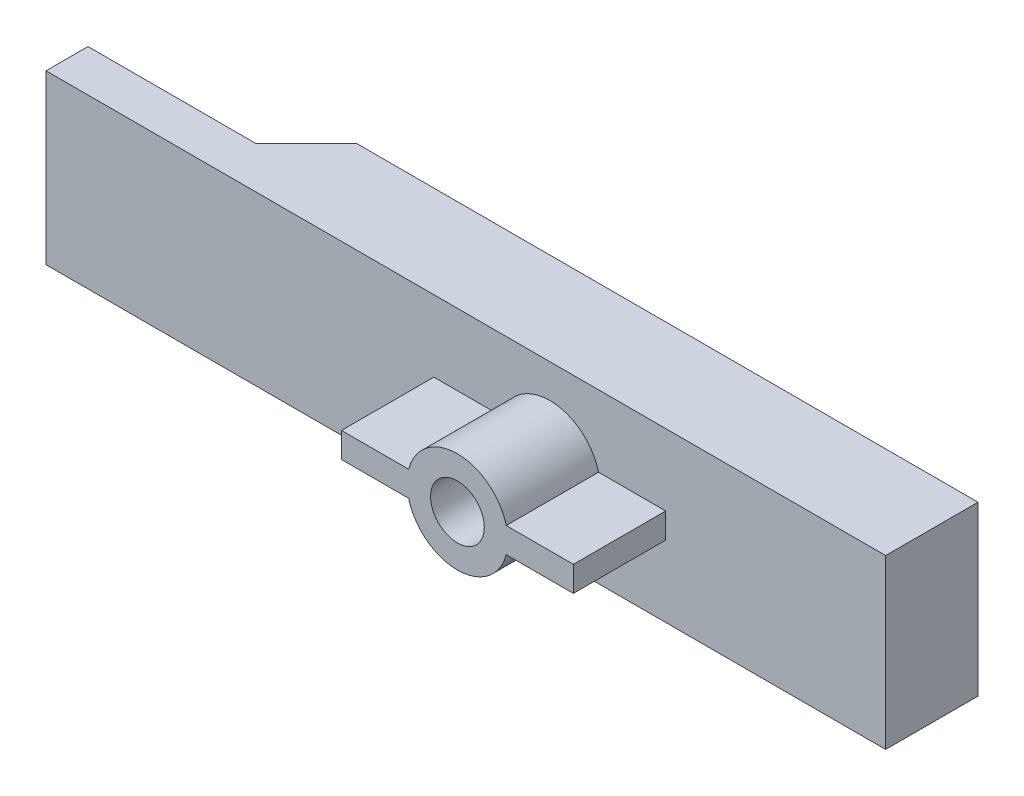
ISO-10303-21;
HEADER;
FILE_DESCRIPTION(('STEP AP214'),'2;1');
FILE_NAME('part.step','',(''),(''),'','','');
FILE_SCHEMA(('AUTOMOTIVE_DESIGN { 1 0 10303 214 1 1 1 1 }'));
ENDSEC;
DATA;
#1=APPLICATION_CONTEXT('core data for automotive mechanical design processes');
#2=APPLICATION_PROTOCOL_DEFINITION('international standard','automotive_design',2000,#1);
#3=PRODUCT_CONTEXT('',#1,'mechanical');
#4=PRODUCT('Part','Part','',(#3));
#5=PRODUCT_RELATED_PRODUCT_CATEGORY('part','',(#4));
#6=PRODUCT_DEFINITION_FORMATION('','',#4);
#7=PRODUCT_DEFINITION_CONTEXT('part definition',#1,'design');
#8=PRODUCT_DEFINITION('design','',#6,#7);
#9=PRODUCT_DEFINITION_SHAPE('','',#8);
#10=(LENGTH_UNIT() NAMED_UNIT(*) SI_UNIT(.MILLI.,.METRE.));
#11=(NAMED_UNIT(*) PLANE_ANGLE_UNIT() SI_UNIT($,.RADIAN.));
#12=(NAMED_UNIT(*) SI_UNIT($,.STERADIAN.) SOLID_ANGLE_UNIT());
#13=UNCERTAINTY_MEASURE_WITH_UNIT(LENGTH_MEASURE(1.E-05),#10,'distance_accuracy_value','');
#14=(GEOMETRIC_REPRESENTATION_CONTEXT(3) GLOBAL_UNCERTAINTY_ASSIGNED_CONTEXT((#13)) GLOBAL_UNIT_ASSIGNED_CONTEXT((#10,
#11,#12)) REPRESENTATION_CONTEXT('',''));
#15=CARTESIAN_POINT('',(0.,0.,0.));
#16=DIRECTION('',(0.,0.,1.));
#17=DIRECTION('',(1.,0.,0.));
#18=AXIS2_PLACEMENT_3D('',#15,#16,#17);
#19=CARTESIAN_POINT('',(0.,0.,2.5));
#20=DIRECTION('',(0.,0.,-1.));
#21=DIRECTION('',(-1.,0.,0.));
#22=AXIS2_PLACEMENT_3D('',#19,#20,#21);
#23=PLANE('',#22);
#24=DIRECTION('',(-1.,0.,0.));
#25=VECTOR('',#24,1.);
#26=CARTESIAN_POINT('',(0.,10.,2.5));
#27=LINE('',#26,#25);
#28=CARTESIAN_POINT('',(40.,10.,2.5));
#29=VERTEX_POINT('',#28);
#30=CARTESIAN_POINT('',(-9.99999999999999,10.,2.5));
#31=VERTEX_POINT('',#30);
#32=EDGE_CURVE('E243',#29,#31,#27,.T.);
#33=ORIENTED_EDGE('',*,*,#32,.T.);
#34=DIRECTION('',(0.,1.,0.));
#35=VECTOR('',#34,1.);
#36=CARTESIAN_POINT('',(-10.,0.,2.5));
#37=LINE('',#36,#35);
#38=CARTESIAN_POINT('',(-10.,0.,2.5));
#39=VERTEX_POINT('',#38);
#40=EDGE_CURVE('E211',#39,#31,#37,.T.);
#41=ORIENTED_EDGE('',*,*,#40,.F.);
#42=DIRECTION('',(1.,0.,0.));
#43=VECTOR('',#42,1.);
#44=CARTESIAN_POINT('',(0.,0.,2.5));
#45=LINE('',#44,#43);
#46=CARTESIAN_POINT('',(40.,0.,2.5));
#47=VERTEX_POINT('',#46);
#48=EDGE_CURVE('E239',#39,#47,#45,.T.);
#49=ORIENTED_EDGE('',*,*,#48,.T.);
#50=DIRECTION('',(0.,1.,0.));
#51=VECTOR('',#50,1.);
#52=CARTESIAN_POINT('',(40.,0.,2.5));
#53=LINE('',#52,#51);
#54=EDGE_CURVE('E241',#47,#29,#53,.T.);
#55=ORIENTED_EDGE('',*,*,#54,.T.);
#56=EDGE_LOOP('',(#33,#41,#49,#55));
#57=FACE_BOUND('',#56,.T.);
#58=DIRECTION('',(-1.,0.,0.));
#59=VECTOR('',#58,1.);
#60=CARTESIAN_POINT('',(22.9047375096556,5.75,2.5));
#61=LINE('',#60,#59);
#62=CARTESIAN_POINT('',(26.9047375096556,5.75,2.5));
#63=VERTEX_POINT('',#62);
#64=CARTESIAN_POINT('',(22.9047375096556,5.75,2.5));
#65=VERTEX_POINT('',#64);
#66=EDGE_CURVE('E153',#63,#65,#61,.T.);
#67=ORIENTED_EDGE('',*,*,#66,.F.);
#68=DIRECTION('',(0.,1.,0.));
#69=VECTOR('',#68,1.);
#70=CARTESIAN_POINT('',(26.9047375096556,5.75,2.5));
#71=LINE('',#70,#69);
#72=CARTESIAN_POINT('',(26.9047375096556,4.25,2.5));
#73=VERTEX_POINT('',#72);
#74=EDGE_CURVE('E149',#73,#63,#71,.T.);
#75=ORIENTED_EDGE('',*,*,#74,.F.);
#76=DIRECTION('',(1.,0.,0.));
#77=VECTOR('',#76,1.);
#78=CARTESIAN_POINT('',(22.9047375096556,4.25,2.5));
#79=LINE('',#78,#77);
#80=CARTESIAN_POINT('',(22.9047375096556,4.25,2.5));
#81=VERTEX_POINT('',#80);
#82=EDGE_CURVE('E175',#81,#73,#79,.T.);
#83=ORIENTED_EDGE('',*,*,#82,.F.);
#84=CARTESIAN_POINT('',(20.,5.,2.5));
#85=DIRECTION('',(0.,0.,-1.));
#86=DIRECTION('',(-1.,0.,0.));
#87=AXIS2_PLACEMENT_3D('',#84,#85,#86);
#88=CIRCLE('',#87,2.99999999999999);
#89=CARTESIAN_POINT('',(17.0952624903444,4.25,2.5));
#90=VERTEX_POINT('',#89);
#91=EDGE_CURVE('E251',#90,#81,#88,.F.);
#92=ORIENTED_EDGE('',*,*,#91,.F.);
#93=DIRECTION('',(1.,0.,0.));
#94=VECTOR('',#93,1.);
#95=CARTESIAN_POINT('',(17.0952624903444,4.25,2.5));
#96=LINE('',#95,#94);
#97=CARTESIAN_POINT('',(13.0952624903444,4.25,2.5));
#98=VERTEX_POINT('',#97);
#99=EDGE_CURVE('E179',#98,#90,#96,.T.);
#100=ORIENTED_EDGE('',*,*,#99,.F.);
#101=DIRECTION('',(0.,-1.,0.));
#102=VECTOR('',#101,1.);
#103=CARTESIAN_POINT('',(13.0952624903444,5.75,2.5));
#104=LINE('',#103,#102);
#105=CARTESIAN_POINT('',(13.0952624903444,5.75,2.5));
#106=VERTEX_POINT('',#105);
#107=EDGE_CURVE('E183',#106,#98,#104,.T.);
#108=ORIENTED_EDGE('',*,*,#107,.F.);
#109=DIRECTION('',(-1.,0.,0.));
#110=VECTOR('',#109,1.);
#111=CARTESIAN_POINT('',(17.0952624903444,5.75,2.5));
#112=LINE('',#111,#110);
#113=CARTESIAN_POINT('',(17.0952624903444,5.75,2.5));
#114=VERTEX_POINT('',#113);
#115=EDGE_CURVE('E187',#114,#106,#112,.T.);
#116=ORIENTED_EDGE('',*,*,#115,.F.);
#117=EDGE_CURVE('E250',#65,#114,#88,.F.);
#118=ORIENTED_EDGE('',*,*,#117,.F.);
#119=EDGE_LOOP('',(#67,#75,#83,#92,#100,#108,#116,#118));
#120=FACE_BOUND('',#119,.T.);
#121=ADVANCED_FACE('F41',(#57,#120),#23,.F.);
#122=CARTESIAN_POINT('',(20.,5.,8.));
#123=DIRECTION('',(0.,0.,-1.));
#124=DIRECTION('',(-1.,0.,0.));
#125=AXIS2_PLACEMENT_3D('',#122,#123,#124);
#126=CYLINDRICAL_SURFACE('',#125,2.99999999999999);
#127=DIRECTION('',(0.,0.,-1.));
#128=VECTOR('',#127,1.);
#129=CARTESIAN_POINT('',(22.9047375096556,5.75,12.2720018726588));
#130=LINE('',#129,#128);
#131=CARTESIAN_POINT('',(22.9047375096556,5.74999999999999,8.));
#132=VERTEX_POINT('',#131);
#133=EDGE_CURVE('E159',#132,#65,#130,.T.);
#134=ORIENTED_EDGE('',*,*,#133,.T.);
#135=ORIENTED_EDGE('',*,*,#117,.T.);
#136=DIRECTION('',(0.,0.,-1.));
#137=VECTOR('',#136,1.);
#138=CARTESIAN_POINT('',(17.0952624903444,5.75,12.2720018726588));
#139=LINE('',#138,#137);
#140=CARTESIAN_POINT('',(17.0952624903444,5.75,8.));
#141=VERTEX_POINT('',#140);
#142=EDGE_CURVE('E190',#141,#114,#139,.T.);
#143=ORIENTED_EDGE('',*,*,#142,.F.);
#144=CARTESIAN_POINT('',(20.,5.,8.));
#145=DIRECTION('',(0.,0.,1.));
#146=DIRECTION('',(1.,0.,0.));
#147=AXIS2_PLACEMENT_3D('',#144,#145,#146);
#148=CIRCLE('',#147,2.99999999999999);
#149=EDGE_CURVE('E227',#132,#141,#148,.T.);
#150=ORIENTED_EDGE('',*,*,#149,.F.);
#151=EDGE_LOOP('',(#134,#135,#143,#150));
#152=FACE_BOUND('',#151,.T.);
#153=ADVANCED_FACE('F292',(#152),#126,.T.);
#154=DIRECTION('',(0.,0.,-1.));
#155=VECTOR('',#154,1.);
#156=CARTESIAN_POINT('',(22.9047375096556,4.25,12.2720018726588));
#157=LINE('',#156,#155);
#158=CARTESIAN_POINT('',(22.9047375096556,4.25,8.));
#159=VERTEX_POINT('',#158);
#160=EDGE_CURVE('E177',#159,#81,#157,.T.);
#161=ORIENTED_EDGE('',*,*,#160,.F.);
#162=CARTESIAN_POINT('',(17.0952624903444,4.25000000000001,8.));
#163=VERTEX_POINT('',#162);
#164=EDGE_CURVE('E230',#163,#159,#148,.T.);
#165=ORIENTED_EDGE('',*,*,#164,.F.);
#166=DIRECTION('',(0.,0.,-1.));
#167=VECTOR('',#166,1.);
#168=CARTESIAN_POINT('',(17.0952624903444,4.25,12.2720018726588));
#169=LINE('',#168,#167);
#170=EDGE_CURVE('E152',#163,#90,#169,.T.);
#171=ORIENTED_EDGE('',*,*,#170,.T.);
#172=ORIENTED_EDGE('',*,*,#91,.T.);
#173=EDGE_LOOP('',(#161,#165,#171,#172));
#174=FACE_BOUND('',#173,.T.);
#175=ADVANCED_FACE('F297',(#174),#126,.T.);
#176=CARTESIAN_POINT('',(0.,0.,2.5));
#177=DIRECTION('',(0.,1.,0.));
#178=DIRECTION('',(0.,0.,1.));
#179=AXIS2_PLACEMENT_3D('',#176,#177,#178);
#180=PLANE('',#179);
#181=DIRECTION('',(1.,0.,0.));
#182=VECTOR('',#181,1.);
#183=CARTESIAN_POINT('',(-10.,0.,0.));
#184=LINE('',#183,#182);
#185=CARTESIAN_POINT('',(-10.,0.,0.));
#186=VERTEX_POINT('',#185);
#187=CARTESIAN_POINT('',(0.,0.,0.));
#188=VERTEX_POINT('',#187);
#189=EDGE_CURVE('E221',#186,#188,#184,.T.);
#190=ORIENTED_EDGE('',*,*,#189,.T.);
#191=DIRECTION('',(0.707106781186546,0.,-0.707106781186549));
#192=VECTOR('',#191,1.);
#193=CARTESIAN_POINT('',(3.,0.,-3.));
#194=LINE('',#193,#192);
#195=CARTESIAN_POINT('',(3.,0.,-3.));
#196=VERTEX_POINT('',#195);
#197=EDGE_CURVE('E11',#188,#196,#194,.T.);
#198=ORIENTED_EDGE('',*,*,#197,.T.);
#199=DIRECTION('',(-1.,0.,0.));
#200=VECTOR('',#199,1.);
#201=CARTESIAN_POINT('',(40.,0.,-3.));
#202=LINE('',#201,#200);
#203=CARTESIAN_POINT('',(40.,0.,-3.));
#204=VERTEX_POINT('',#203);
#205=EDGE_CURVE('E235',#204,#196,#202,.T.);
#206=ORIENTED_EDGE('',*,*,#205,.F.);
#207=DIRECTION('',(0.,0.,-1.));
#208=VECTOR('',#207,1.);
#209=CARTESIAN_POINT('',(40.,0.,2.5));
#210=LINE('',#209,#208);
#211=EDGE_CURVE('E248',#47,#204,#210,.T.);
#212=ORIENTED_EDGE('',*,*,#211,.F.);
#213=ORIENTED_EDGE('',*,*,#48,.F.);
#214=DIRECTION('',(0.,0.,1.));
#215=VECTOR('',#214,1.);
#216=CARTESIAN_POINT('',(-10.,0.,0.));
#217=LINE('',#216,#215);
#218=EDGE_CURVE('E208',#186,#39,#217,.T.);
#219=ORIENTED_EDGE('',*,*,#218,.F.);
#220=EDGE_LOOP('',(#190,#198,#206,#212,#213,#219));
#221=FACE_BOUND('',#220,.T.);
#222=ADVANCED_FACE('F268',(#221),#180,.F.);
#223=CARTESIAN_POINT('',(40.,0.,2.5));
#224=DIRECTION('',(-1.,0.,0.));
#225=DIRECTION('',(0.,-1.,0.));
#226=AXIS2_PLACEMENT_3D('',#223,#224,#225);
#227=PLANE('',#226);
#228=ORIENTED_EDGE('',*,*,#211,.T.);
#229=DIRECTION('',(0.,-1.,0.));
#230=VECTOR('',#229,1.);
#231=CARTESIAN_POINT('',(40.,10.,-3.));
#232=LINE('',#231,#230);
#233=CARTESIAN_POINT('',(40.,10.,-3.));
#234=VERTEX_POINT('',#233);
#235=EDGE_CURVE('E232',#234,#204,#232,.T.);
#236=ORIENTED_EDGE('',*,*,#235,.F.);
#237=DIRECTION('',(0.,0.,-1.));
#238=VECTOR('',#237,1.);
#239=CARTESIAN_POINT('',(40.,10.,2.5));
#240=LINE('',#239,#238);
#241=EDGE_CURVE('E245',#29,#234,#240,.T.);
#242=ORIENTED_EDGE('',*,*,#241,.F.);
#243=ORIENTED_EDGE('',*,*,#54,.F.);
#244=EDGE_LOOP('',(#228,#236,#242,#243));
#245=FACE_BOUND('',#244,.T.);
#246=ADVANCED_FACE('F272',(#245),#227,.F.);
#247=CARTESIAN_POINT('',(0.,10.,2.5));
#248=DIRECTION('',(0.,-1.,0.));
#249=DIRECTION('',(0.,0.,-1.));
#250=AXIS2_PLACEMENT_3D('',#247,#248,#249);
#251=PLANE('',#250);
#252=DIRECTION('',(1.,0.,0.));
#253=VECTOR('',#252,1.);
#254=CARTESIAN_POINT('',(40.,10.,-3.));
#255=LINE('',#254,#253);
#256=CARTESIAN_POINT('',(3.,10.,-3.));
#257=VERTEX_POINT('',#256);
#258=EDGE_CURVE('E237',#257,#234,#255,.T.);
#259=ORIENTED_EDGE('',*,*,#258,.F.);
#260=DIRECTION('',(-0.707106781186546,0.,0.707106781186549));
#261=VECTOR('',#260,1.);
#262=CARTESIAN_POINT('',(3.,10.,-3.));
#263=LINE('',#262,#261);
#264=CARTESIAN_POINT('',(0.,10.,0.));
#265=VERTEX_POINT('',#264);
#266=EDGE_CURVE('E50',#257,#265,#263,.T.);
#267=ORIENTED_EDGE('',*,*,#266,.T.);
#268=DIRECTION('',(1.,0.,0.));
#269=VECTOR('',#268,1.);
#270=CARTESIAN_POINT('',(-9.99999999999999,10.,0.));
#271=LINE('',#270,#269);
#272=CARTESIAN_POINT('',(-9.99999999999999,10.,0.));
#273=VERTEX_POINT('',#272);
#274=EDGE_CURVE('E216',#273,#265,#271,.T.);
#275=ORIENTED_EDGE('',*,*,#274,.F.);
#276=DIRECTION('',(0.,0.,-1.));
#277=VECTOR('',#276,1.);
#278=CARTESIAN_POINT('',(-9.99999999999999,10.,0.));
#279=LINE('',#278,#277);
#280=EDGE_CURVE('E214',#31,#273,#279,.T.);
#281=ORIENTED_EDGE('',*,*,#280,.F.);
#282=ORIENTED_EDGE('',*,*,#32,.F.);
#283=ORIENTED_EDGE('',*,*,#241,.T.);
#284=EDGE_LOOP('',(#259,#267,#275,#281,#282,#283));
#285=FACE_BOUND('',#284,.T.);
#286=ADVANCED_FACE('F258',(#285),#251,.F.);
#287=CARTESIAN_POINT('',(0.,0.,-3.));
#288=DIRECTION('',(0.,0.,-1.));
#289=DIRECTION('',(-1.,0.,0.));
#290=AXIS2_PLACEMENT_3D('',#287,#288,#289);
#291=PLANE('',#290);
#292=ORIENTED_EDGE('',*,*,#205,.T.);
#293=DIRECTION('',(0.,1.,0.));
#294=VECTOR('',#293,1.);
#295=CARTESIAN_POINT('',(3.,10.,-3.));
#296=LINE('',#295,#294);
#297=EDGE_CURVE('E254',#196,#257,#296,.T.);
#298=ORIENTED_EDGE('',*,*,#297,.T.);
#299=ORIENTED_EDGE('',*,*,#258,.T.);
#300=ORIENTED_EDGE('',*,*,#235,.T.);
#301=EDGE_LOOP('',(#292,#298,#299,#300));
#302=FACE_BOUND('',#301,.T.);
#303=ADVANCED_FACE('F265',(#302),#291,.T.);
#304=CARTESIAN_POINT('',(20.,5.,8.));
#305=DIRECTION('',(0.,0.,1.));
#306=DIRECTION('',(1.,0.,0.));
#307=AXIS2_PLACEMENT_3D('',#304,#305,#306);
#308=PLANE('',#307);
#309=ORIENTED_EDGE('',*,*,#164,.T.);
#310=DIRECTION('',(1.,0.,0.));
#311=VECTOR('',#310,1.);
#312=CARTESIAN_POINT('',(22.9047375096556,4.25,8.));
#313=LINE('',#312,#311);
#314=CARTESIAN_POINT('',(26.9047375096556,4.25,8.));
#315=VERTEX_POINT('',#314);
#316=EDGE_CURVE('E162',#159,#315,#313,.T.);
#317=ORIENTED_EDGE('',*,*,#316,.T.);
#318=DIRECTION('',(0.,1.,0.));
#319=VECTOR('',#318,1.);
#320=CARTESIAN_POINT('',(26.9047375096556,5.75,8.));
#321=LINE('',#320,#319);
#322=CARTESIAN_POINT('',(26.9047375096556,5.75,8.));
#323=VERTEX_POINT('',#322);
#324=EDGE_CURVE('E146',#315,#323,#321,.T.);
#325=ORIENTED_EDGE('',*,*,#324,.T.);
#326=DIRECTION('',(-1.,0.,0.));
#327=VECTOR('',#326,1.);
#328=CARTESIAN_POINT('',(22.9047375096556,5.75,8.));
#329=LINE('',#328,#327);
#330=EDGE_CURVE('E156',#323,#132,#329,.T.);
#331=ORIENTED_EDGE('',*,*,#330,.T.);
#332=ORIENTED_EDGE('',*,*,#149,.T.);
#333=DIRECTION('',(-1.,0.,0.));
#334=VECTOR('',#333,1.);
#335=CARTESIAN_POINT('',(17.0952624903444,5.75,8.));
#336=LINE('',#335,#334);
#337=CARTESIAN_POINT('',(13.0952624903444,5.75,8.));
#338=VERTEX_POINT('',#337);
#339=EDGE_CURVE('E195',#141,#338,#336,.T.);
#340=ORIENTED_EDGE('',*,*,#339,.T.);
#341=DIRECTION('',(0.,-1.,0.));
#342=VECTOR('',#341,1.);
#343=CARTESIAN_POINT('',(13.0952624903444,5.75,8.));
#344=LINE('',#343,#342);
#345=CARTESIAN_POINT('',(13.0952624903444,4.25,8.));
#346=VERTEX_POINT('',#345);
#347=EDGE_CURVE('E191',#338,#346,#344,.T.);
#348=ORIENTED_EDGE('',*,*,#347,.T.);
#349=DIRECTION('',(1.,0.,0.));
#350=VECTOR('',#349,1.);
#351=CARTESIAN_POINT('',(17.0952624903444,4.25,8.));
#352=LINE('',#351,#350);
#353=EDGE_CURVE('E181',#346,#163,#352,.T.);
#354=ORIENTED_EDGE('',*,*,#353,.T.);
#355=EDGE_LOOP('',(#309,#317,#325,#331,#332,#340,#348,#354));
#356=FACE_BOUND('',#355,.T.);
#357=CARTESIAN_POINT('',(20.,5.,8.));
#358=DIRECTION('',(0.,0.,1.));
#359=DIRECTION('',(1.,0.,0.));
#360=AXIS2_PLACEMENT_3D('',#357,#358,#359);
#361=CIRCLE('',#360,1.6);
#362=CARTESIAN_POINT('',(21.6,5.,8.));
#363=VERTEX_POINT('',#362);
#364=EDGE_CURVE('E224',#363,#363,#361,.T.);
#365=ORIENTED_EDGE('',*,*,#364,.F.);
#366=EDGE_LOOP('',(#365));
#367=FACE_BOUND('',#366,.T.);
#368=ADVANCED_FACE('F165',(#356,#367),#308,.T.);
#369=CARTESIAN_POINT('',(20.,5.,8.));
#370=DIRECTION('',(0.,0.,-1.));
#371=DIRECTION('',(-1.,0.,0.));
#372=AXIS2_PLACEMENT_3D('',#369,#370,#371);
#373=CYLINDRICAL_SURFACE('',#372,1.6);
#374=ORIENTED_EDGE('',*,*,#364,.T.);
#375=EDGE_LOOP('',(#374));
#376=FACE_BOUND('',#375,.T.);
#377=CARTESIAN_POINT('',(20.,5.,2.5));
#378=DIRECTION('',(0.,0.,1.));
#379=DIRECTION('',(1.,0.,0.));
#380=AXIS2_PLACEMENT_3D('',#377,#378,#379);
#381=CIRCLE('',#380,1.6);
#382=CARTESIAN_POINT('',(21.6,5.,2.5));
#383=VERTEX_POINT('',#382);
#384=EDGE_CURVE('E223',#383,#383,#381,.T.);
#385=ORIENTED_EDGE('',*,*,#384,.F.);
#386=EDGE_LOOP('',(#385));
#387=FACE_BOUND('',#386,.T.);
#388=ADVANCED_FACE('F303',(#376,#387),#373,.F.);
#389=ORIENTED_EDGE('',*,*,#384,.T.);
#390=EDGE_LOOP('',(#389));
#391=FACE_BOUND('',#390,.T.);
#392=ADVANCED_FACE('F289',(#391),#23,.F.);
#393=CARTESIAN_POINT('',(-10.,0.,0.));
#394=DIRECTION('',(0.,0.,1.));
#395=DIRECTION('',(1.,0.,0.));
#396=AXIS2_PLACEMENT_3D('',#393,#394,#395);
#397=PLANE('',#396);
#398=DIRECTION('',(0.,-1.,0.));
#399=VECTOR('',#398,1.);
#400=CARTESIAN_POINT('',(0.,0.,0.));
#401=LINE('',#400,#399);
#402=EDGE_CURVE('E194',#265,#188,#401,.T.);
#403=ORIENTED_EDGE('',*,*,#402,.T.);
#404=ORIENTED_EDGE('',*,*,#189,.F.);
#405=DIRECTION('',(0.,-1.,0.));
#406=VECTOR('',#405,1.);
#407=CARTESIAN_POINT('',(-10.,0.,0.));
#408=LINE('',#407,#406);
#409=EDGE_CURVE('E205',#273,#186,#408,.T.);
#410=ORIENTED_EDGE('',*,*,#409,.F.);
#411=ORIENTED_EDGE('',*,*,#274,.T.);
#412=EDGE_LOOP('',(#403,#404,#410,#411));
#413=FACE_BOUND('',#412,.T.);
#414=ADVANCED_FACE('F262',(#413),#397,.F.);
#415=CARTESIAN_POINT('',(-10.,0.,0.));
#416=DIRECTION('',(1.,0.,0.));
#417=DIRECTION('',(0.,1.,0.));
#418=AXIS2_PLACEMENT_3D('',#415,#416,#417);
#419=PLANE('',#418);
#420=ORIENTED_EDGE('',*,*,#409,.T.);
#421=ORIENTED_EDGE('',*,*,#218,.T.);
#422=ORIENTED_EDGE('',*,*,#40,.T.);
#423=ORIENTED_EDGE('',*,*,#280,.T.);
#424=EDGE_LOOP('',(#420,#421,#422,#423));
#425=FACE_BOUND('',#424,.T.);
#426=ADVANCED_FACE('F278',(#425),#419,.F.);
#427=CARTESIAN_POINT('',(17.0952624903444,5.75,12.2720018726588));
#428=DIRECTION('',(0.,-1.,0.));
#429=DIRECTION('',(0.,0.,-1.));
#430=AXIS2_PLACEMENT_3D('',#427,#428,#429);
#431=PLANE('',#430);
#432=ORIENTED_EDGE('',*,*,#339,.F.);
#433=ORIENTED_EDGE('',*,*,#142,.T.);
#434=ORIENTED_EDGE('',*,*,#115,.T.);
#435=DIRECTION('',(0.,0.,-1.));
#436=VECTOR('',#435,1.);
#437=CARTESIAN_POINT('',(13.0952624903444,5.75,12.2720018726588));
#438=LINE('',#437,#436);
#439=EDGE_CURVE('E186',#338,#106,#438,.T.);
#440=ORIENTED_EDGE('',*,*,#439,.F.);
#441=EDGE_LOOP('',(#432,#433,#434,#440));
#442=FACE_BOUND('',#441,.T.);
#443=ADVANCED_FACE('F280',(#442),#431,.F.);
#444=CARTESIAN_POINT('',(13.0952624903444,5.75,12.2720018726588));
#445=DIRECTION('',(1.,0.,0.));
#446=DIRECTION('',(0.,0.,-1.));
#447=AXIS2_PLACEMENT_3D('',#444,#445,#446);
#448=PLANE('',#447);
#449=ORIENTED_EDGE('',*,*,#347,.F.);
#450=ORIENTED_EDGE('',*,*,#439,.T.);
#451=ORIENTED_EDGE('',*,*,#107,.T.);
#452=DIRECTION('',(0.,0.,-1.));
#453=VECTOR('',#452,1.);
#454=CARTESIAN_POINT('',(13.0952624903444,4.25,12.2720018726588));
#455=LINE('',#454,#453);
#456=EDGE_CURVE('E182',#346,#98,#455,.T.);
#457=ORIENTED_EDGE('',*,*,#456,.F.);
#458=EDGE_LOOP('',(#449,#450,#451,#457));
#459=FACE_BOUND('',#458,.T.);
#460=ADVANCED_FACE('F286',(#459),#448,.F.);
#461=CARTESIAN_POINT('',(17.0952624903444,4.25,12.2720018726588));
#462=DIRECTION('',(0.,1.,0.));
#463=DIRECTION('',(-1.,0.,0.));
#464=AXIS2_PLACEMENT_3D('',#461,#462,#463);
#465=PLANE('',#464);
#466=ORIENTED_EDGE('',*,*,#353,.F.);
#467=ORIENTED_EDGE('',*,*,#456,.T.);
#468=ORIENTED_EDGE('',*,*,#99,.T.);
#469=ORIENTED_EDGE('',*,*,#170,.F.);
#470=EDGE_LOOP('',(#466,#467,#468,#469));
#471=FACE_BOUND('',#470,.T.);
#472=ADVANCED_FACE('F339',(#471),#465,.F.);
#473=CARTESIAN_POINT('',(22.9047375096556,5.75,12.2720018726588));
#474=DIRECTION('',(0.,-1.,0.));
#475=DIRECTION('',(1.,0.,0.));
#476=AXIS2_PLACEMENT_3D('',#473,#474,#475);
#477=PLANE('',#476);
#478=ORIENTED_EDGE('',*,*,#330,.F.);
#479=DIRECTION('',(0.,0.,-1.));
#480=VECTOR('',#479,1.);
#481=CARTESIAN_POINT('',(26.9047375096556,5.75,12.2720018726588));
#482=LINE('',#481,#480);
#483=EDGE_CURVE('E142',#323,#63,#482,.T.);
#484=ORIENTED_EDGE('',*,*,#483,.T.);
#485=ORIENTED_EDGE('',*,*,#66,.T.);
#486=ORIENTED_EDGE('',*,*,#133,.F.);
#487=EDGE_LOOP('',(#478,#484,#485,#486));
#488=FACE_BOUND('',#487,.T.);
#489=ADVANCED_FACE('F157',(#488),#477,.F.);
#490=CARTESIAN_POINT('',(22.9047375096556,4.25,12.2720018726588));
#491=DIRECTION('',(0.,1.,0.));
#492=DIRECTION('',(-1.,0.,0.));
#493=AXIS2_PLACEMENT_3D('',#490,#491,#492);
#494=PLANE('',#493);
#495=ORIENTED_EDGE('',*,*,#316,.F.);
#496=ORIENTED_EDGE('',*,*,#160,.T.);
#497=ORIENTED_EDGE('',*,*,#82,.T.);
#498=DIRECTION('',(0.,0.,-1.));
#499=VECTOR('',#498,1.);
#500=CARTESIAN_POINT('',(26.9047375096556,4.25,12.2720018726588));
#501=LINE('',#500,#499);
#502=EDGE_CURVE('E168',#315,#73,#501,.T.);
#503=ORIENTED_EDGE('',*,*,#502,.F.);
#504=EDGE_LOOP('',(#495,#496,#497,#503));
#505=FACE_BOUND('',#504,.T.);
#506=ADVANCED_FACE('F342',(#505),#494,.F.);
#507=CARTESIAN_POINT('',(26.9047375096556,5.75,12.2720018726588));
#508=DIRECTION('',(-1.,0.,0.));
#509=DIRECTION('',(0.,-1.,0.));
#510=AXIS2_PLACEMENT_3D('',#507,#508,#509);
#511=PLANE('',#510);
#512=ORIENTED_EDGE('',*,*,#324,.F.);
#513=ORIENTED_EDGE('',*,*,#502,.T.);
#514=ORIENTED_EDGE('',*,*,#74,.T.);
#515=ORIENTED_EDGE('',*,*,#483,.F.);
#516=EDGE_LOOP('',(#512,#513,#514,#515));
#517=FACE_BOUND('',#516,.T.);
#518=ADVANCED_FACE('F144',(#517),#511,.F.);
#519=CARTESIAN_POINT('',(3.,0.,-3.));
#520=DIRECTION('',(-0.707106781186549,0.,-0.707106781186546));
#521=DIRECTION('',(0.,-1.,0.));
#522=AXIS2_PLACEMENT_3D('',#519,#520,#521);
#523=PLANE('',#522);
#524=ORIENTED_EDGE('',*,*,#197,.F.);
#525=ORIENTED_EDGE('',*,*,#402,.F.);
#526=ORIENTED_EDGE('',*,*,#266,.F.);
#527=ORIENTED_EDGE('',*,*,#297,.F.);
#528=EDGE_LOOP('',(#524,#525,#526,#527));
#529=FACE_BOUND('',#528,.T.);
#530=ADVANCED_FACE('F44',(#529),#523,.T.);
#531=CLOSED_SHELL('',(#121,#153,#175,#222,#246,#286,#303,#368,#388,#392,#414,#426,#443,#460,
#472,#489,#506,#518,#530));
#532=MANIFOLD_SOLID_BREP('B2',#531);
#533=ADVANCED_BREP_SHAPE_REPRESENTATION('',(#18,#532),#14);
#534=SHAPE_DEFINITION_REPRESENTATION(#9,#533);
ENDSEC;
END-ISO-10303-21;
